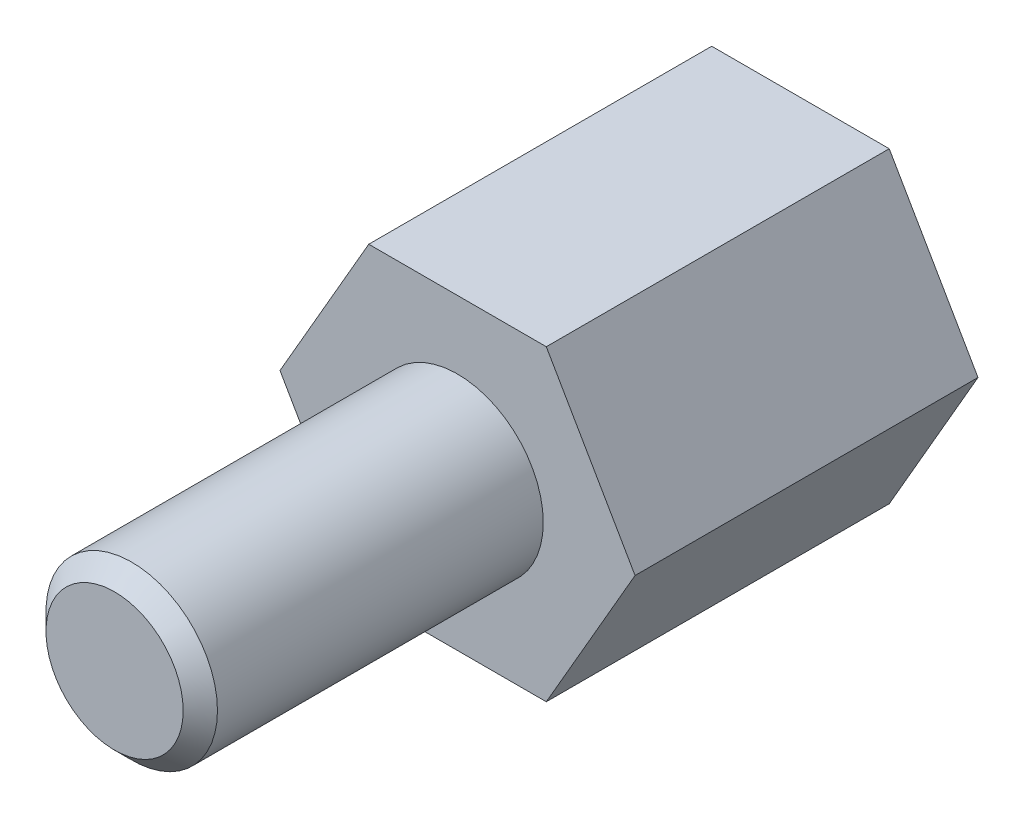
ISO-10303-21;
HEADER;
FILE_DESCRIPTION(('STEP AP214'),'2;1');
FILE_NAME('part.step','',(''),(''),'','','');
FILE_SCHEMA(('AUTOMOTIVE_DESIGN { 1 0 10303 214 1 1 1 1 }'));
ENDSEC;
DATA;
#1=APPLICATION_CONTEXT('core data for automotive mechanical design processes');
#2=APPLICATION_PROTOCOL_DEFINITION('international standard','automotive_design',2000,#1);
#3=PRODUCT_CONTEXT('',#1,'mechanical');
#4=PRODUCT('Part','Part','',(#3));
#5=PRODUCT_RELATED_PRODUCT_CATEGORY('part','',(#4));
#6=PRODUCT_DEFINITION_FORMATION('','',#4);
#7=PRODUCT_DEFINITION_CONTEXT('part definition',#1,'design');
#8=PRODUCT_DEFINITION('design','',#6,#7);
#9=PRODUCT_DEFINITION_SHAPE('','',#8);
#10=(LENGTH_UNIT() NAMED_UNIT(*) SI_UNIT(.MILLI.,.METRE.));
#11=(NAMED_UNIT(*) PLANE_ANGLE_UNIT() SI_UNIT($,.RADIAN.));
#12=(NAMED_UNIT(*) SI_UNIT($,.STERADIAN.) SOLID_ANGLE_UNIT());
#13=UNCERTAINTY_MEASURE_WITH_UNIT(LENGTH_MEASURE(1.E-05),#10,'distance_accuracy_value','');
#14=(GEOMETRIC_REPRESENTATION_CONTEXT(3) GLOBAL_UNCERTAINTY_ASSIGNED_CONTEXT((#13)) GLOBAL_UNIT_ASSIGNED_CONTEXT((#10,
#11,#12)) REPRESENTATION_CONTEXT('',''));
#15=CARTESIAN_POINT('',(0.,0.,0.));
#16=DIRECTION('',(0.,0.,1.));
#17=DIRECTION('',(1.,0.,0.));
#18=AXIS2_PLACEMENT_3D('',#15,#16,#17);
#19=CARTESIAN_POINT('',(0.,0.,6.));
#20=DIRECTION('',(0.,0.,1.));
#21=DIRECTION('',(1.,0.,0.));
#22=AXIS2_PLACEMENT_3D('',#19,#20,#21);
#23=PLANE('',#22);
#24=DIRECTION('',(-1.,0.,0.));
#25=VECTOR('',#24,1.);
#26=CARTESIAN_POINT('',(1.55307222412009,2.69,6.));
#27=LINE('',#26,#25);
#28=CARTESIAN_POINT('',(1.55307222412009,2.69,6.));
#29=VERTEX_POINT('',#28);
#30=CARTESIAN_POINT('',(-1.55307222412009,2.69,6.));
#31=VERTEX_POINT('',#30);
#32=EDGE_CURVE('E137',#29,#31,#27,.T.);
#33=ORIENTED_EDGE('',*,*,#32,.T.);
#34=DIRECTION('',(-0.5,-0.866025403784438,0.));
#35=VECTOR('',#34,1.);
#36=CARTESIAN_POINT('',(-1.55307222412009,2.69,6.));
#37=LINE('',#36,#35);
#38=CARTESIAN_POINT('',(-3.10614444824019,0.,6.));
#39=VERTEX_POINT('',#38);
#40=EDGE_CURVE('E94',#31,#39,#37,.T.);
#41=ORIENTED_EDGE('',*,*,#40,.T.);
#42=DIRECTION('',(0.5,-0.866025403784439,0.));
#43=VECTOR('',#42,1.);
#44=CARTESIAN_POINT('',(-3.10614444824019,0.,6.));
#45=LINE('',#44,#43);
#46=CARTESIAN_POINT('',(-1.5530722241201,-2.69,6.));
#47=VERTEX_POINT('',#46);
#48=EDGE_CURVE('E108',#39,#47,#45,.T.);
#49=ORIENTED_EDGE('',*,*,#48,.T.);
#50=DIRECTION('',(1.,0.,0.));
#51=VECTOR('',#50,1.);
#52=CARTESIAN_POINT('',(-1.5530722241201,-2.69,6.));
#53=LINE('',#52,#51);
#54=CARTESIAN_POINT('',(1.55307222412009,-2.69,6.));
#55=VERTEX_POINT('',#54);
#56=EDGE_CURVE('E102',#47,#55,#53,.T.);
#57=ORIENTED_EDGE('',*,*,#56,.T.);
#58=DIRECTION('',(0.5,0.866025403784438,0.));
#59=VECTOR('',#58,1.);
#60=CARTESIAN_POINT('',(1.55307222412009,-2.69,6.));
#61=LINE('',#60,#59);
#62=CARTESIAN_POINT('',(3.10614444824019,0.,6.));
#63=VERTEX_POINT('',#62);
#64=EDGE_CURVE('E106',#55,#63,#61,.T.);
#65=ORIENTED_EDGE('',*,*,#64,.T.);
#66=DIRECTION('',(-0.5,0.866025403784439,0.));
#67=VECTOR('',#66,1.);
#68=CARTESIAN_POINT('',(3.10614444824019,0.,6.));
#69=LINE('',#68,#67);
#70=EDGE_CURVE('E55',#63,#29,#69,.T.);
#71=ORIENTED_EDGE('',*,*,#70,.T.);
#72=EDGE_LOOP('',(#33,#41,#49,#57,#65,#71));
#73=FACE_BOUND('',#72,.T.);
#74=CARTESIAN_POINT('',(0.,0.,6.));
#75=DIRECTION('',(0.,0.,1.));
#76=DIRECTION('',(1.,0.,0.));
#77=AXIS2_PLACEMENT_3D('',#74,#75,#76);
#78=CIRCLE('',#77,1.5);
#79=CARTESIAN_POINT('',(1.5,0.,6.));
#80=VERTEX_POINT('',#79);
#81=EDGE_CURVE('E130',#80,#80,#78,.T.);
#82=ORIENTED_EDGE('',*,*,#81,.F.);
#83=EDGE_LOOP('',(#82));
#84=FACE_BOUND('',#83,.T.);
#85=ADVANCED_FACE('F38',(#73,#84),#23,.T.);
#86=CARTESIAN_POINT('',(1.55307222412009,2.69,6.));
#87=DIRECTION('',(0.,-1.,0.));
#88=DIRECTION('',(1.,0.,0.));
#89=AXIS2_PLACEMENT_3D('',#86,#87,#88);
#90=PLANE('',#89);
#91=DIRECTION('',(-1.,0.,0.));
#92=VECTOR('',#91,1.);
#93=CARTESIAN_POINT('',(1.55307222412009,2.69,0.));
#94=LINE('',#93,#92);
#95=CARTESIAN_POINT('',(1.55307222412009,2.69,0.));
#96=VERTEX_POINT('',#95);
#97=CARTESIAN_POINT('',(-1.55307222412009,2.69,0.));
#98=VERTEX_POINT('',#97);
#99=EDGE_CURVE('E126',#96,#98,#94,.T.);
#100=ORIENTED_EDGE('',*,*,#99,.T.);
#101=DIRECTION('',(0.,0.,-1.));
#102=VECTOR('',#101,1.);
#103=CARTESIAN_POINT('',(-1.55307222412009,2.69,6.));
#104=LINE('',#103,#102);
#105=EDGE_CURVE('E144',#31,#98,#104,.T.);
#106=ORIENTED_EDGE('',*,*,#105,.F.);
#107=ORIENTED_EDGE('',*,*,#32,.F.);
#108=DIRECTION('',(0.,0.,-1.));
#109=VECTOR('',#108,1.);
#110=CARTESIAN_POINT('',(1.55307222412009,2.69,6.));
#111=LINE('',#110,#109);
#112=EDGE_CURVE('E122',#29,#96,#111,.T.);
#113=ORIENTED_EDGE('',*,*,#112,.T.);
#114=EDGE_LOOP('',(#100,#106,#107,#113));
#115=FACE_BOUND('',#114,.T.);
#116=ADVANCED_FACE('F161',(#115),#90,.F.);
#117=CARTESIAN_POINT('',(-1.55307222412009,2.69,6.));
#118=DIRECTION('',(0.866025403784439,-0.5,0.));
#119=DIRECTION('',(0.5,0.866025403784439,0.));
#120=AXIS2_PLACEMENT_3D('',#117,#118,#119);
#121=PLANE('',#120);
#122=DIRECTION('',(-0.5,-0.866025403784438,0.));
#123=VECTOR('',#122,1.);
#124=CARTESIAN_POINT('',(-1.55307222412009,2.69,0.));
#125=LINE('',#124,#123);
#126=CARTESIAN_POINT('',(-3.10614444824019,0.,0.));
#127=VERTEX_POINT('',#126);
#128=EDGE_CURVE('E129',#98,#127,#125,.T.);
#129=ORIENTED_EDGE('',*,*,#128,.T.);
#130=DIRECTION('',(0.,0.,-1.));
#131=VECTOR('',#130,1.);
#132=CARTESIAN_POINT('',(-3.10614444824019,0.,6.));
#133=LINE('',#132,#131);
#134=EDGE_CURVE('E141',#39,#127,#133,.T.);
#135=ORIENTED_EDGE('',*,*,#134,.F.);
#136=ORIENTED_EDGE('',*,*,#40,.F.);
#137=ORIENTED_EDGE('',*,*,#105,.T.);
#138=EDGE_LOOP('',(#129,#135,#136,#137));
#139=FACE_BOUND('',#138,.T.);
#140=ADVANCED_FACE('F166',(#139),#121,.F.);
#141=CARTESIAN_POINT('',(-3.10614444824019,0.,6.));
#142=DIRECTION('',(0.866025403784439,0.5,0.));
#143=DIRECTION('',(-0.5,0.866025403784439,0.));
#144=AXIS2_PLACEMENT_3D('',#141,#142,#143);
#145=PLANE('',#144);
#146=DIRECTION('',(0.5,-0.866025403784439,0.));
#147=VECTOR('',#146,1.);
#148=CARTESIAN_POINT('',(-3.10614444824019,0.,0.));
#149=LINE('',#148,#147);
#150=CARTESIAN_POINT('',(-1.5530722241201,-2.69,0.));
#151=VERTEX_POINT('',#150);
#152=EDGE_CURVE('E132',#127,#151,#149,.T.);
#153=ORIENTED_EDGE('',*,*,#152,.T.);
#154=DIRECTION('',(0.,0.,-1.));
#155=VECTOR('',#154,1.);
#156=CARTESIAN_POINT('',(-1.5530722241201,-2.69,6.));
#157=LINE('',#156,#155);
#158=EDGE_CURVE('E117',#47,#151,#157,.T.);
#159=ORIENTED_EDGE('',*,*,#158,.F.);
#160=ORIENTED_EDGE('',*,*,#48,.F.);
#161=ORIENTED_EDGE('',*,*,#134,.T.);
#162=EDGE_LOOP('',(#153,#159,#160,#161));
#163=FACE_BOUND('',#162,.T.);
#164=ADVANCED_FACE('F183',(#163),#145,.F.);
#165=CARTESIAN_POINT('',(-1.5530722241201,-2.69,6.));
#166=DIRECTION('',(0.,1.,0.));
#167=DIRECTION('',(0.,0.,1.));
#168=AXIS2_PLACEMENT_3D('',#165,#166,#167);
#169=PLANE('',#168);
#170=DIRECTION('',(1.,0.,0.));
#171=VECTOR('',#170,1.);
#172=CARTESIAN_POINT('',(-1.5530722241201,-2.69,0.));
#173=LINE('',#172,#171);
#174=CARTESIAN_POINT('',(1.55307222412009,-2.69,0.));
#175=VERTEX_POINT('',#174);
#176=EDGE_CURVE('E116',#151,#175,#173,.T.);
#177=ORIENTED_EDGE('',*,*,#176,.T.);
#178=DIRECTION('',(0.,0.,-1.));
#179=VECTOR('',#178,1.);
#180=CARTESIAN_POINT('',(1.55307222412009,-2.69,6.));
#181=LINE('',#180,#179);
#182=EDGE_CURVE('E113',#55,#175,#181,.T.);
#183=ORIENTED_EDGE('',*,*,#182,.F.);
#184=ORIENTED_EDGE('',*,*,#56,.F.);
#185=ORIENTED_EDGE('',*,*,#158,.T.);
#186=EDGE_LOOP('',(#177,#183,#184,#185));
#187=FACE_BOUND('',#186,.T.);
#188=ADVANCED_FACE('F114',(#187),#169,.F.);
#189=CARTESIAN_POINT('',(1.55307222412009,-2.69,6.));
#190=DIRECTION('',(-0.866025403784438,0.5,0.));
#191=DIRECTION('',(-0.5,-0.866025403784439,0.));
#192=AXIS2_PLACEMENT_3D('',#189,#190,#191);
#193=PLANE('',#192);
#194=DIRECTION('',(0.5,0.866025403784438,0.));
#195=VECTOR('',#194,1.);
#196=CARTESIAN_POINT('',(1.55307222412009,-2.69,0.));
#197=LINE('',#196,#195);
#198=CARTESIAN_POINT('',(3.10614444824019,0.,0.));
#199=VERTEX_POINT('',#198);
#200=EDGE_CURVE('E79',#175,#199,#197,.T.);
#201=ORIENTED_EDGE('',*,*,#200,.T.);
#202=DIRECTION('',(0.,0.,-1.));
#203=VECTOR('',#202,1.);
#204=CARTESIAN_POINT('',(3.10614444824019,0.,6.));
#205=LINE('',#204,#203);
#206=EDGE_CURVE('E118',#63,#199,#205,.T.);
#207=ORIENTED_EDGE('',*,*,#206,.F.);
#208=ORIENTED_EDGE('',*,*,#64,.F.);
#209=ORIENTED_EDGE('',*,*,#182,.T.);
#210=EDGE_LOOP('',(#201,#207,#208,#209));
#211=FACE_BOUND('',#210,.T.);
#212=ADVANCED_FACE('F120',(#211),#193,.F.);
#213=CARTESIAN_POINT('',(3.10614444824019,0.,6.));
#214=DIRECTION('',(-0.866025403784439,-0.5,0.));
#215=DIRECTION('',(0.5,-0.866025403784439,0.));
#216=AXIS2_PLACEMENT_3D('',#213,#214,#215);
#217=PLANE('',#216);
#218=DIRECTION('',(-0.5,0.866025403784439,0.));
#219=VECTOR('',#218,1.);
#220=CARTESIAN_POINT('',(3.10614444824019,0.,0.));
#221=LINE('',#220,#219);
#222=EDGE_CURVE('E85',#199,#96,#221,.T.);
#223=ORIENTED_EDGE('',*,*,#222,.T.);
#224=ORIENTED_EDGE('',*,*,#112,.F.);
#225=ORIENTED_EDGE('',*,*,#70,.F.);
#226=ORIENTED_EDGE('',*,*,#206,.T.);
#227=EDGE_LOOP('',(#223,#224,#225,#226));
#228=FACE_BOUND('',#227,.T.);
#229=ADVANCED_FACE('F175',(#228),#217,.F.);
#230=CARTESIAN_POINT('',(0.,0.,0.));
#231=DIRECTION('',(0.,0.,1.));
#232=DIRECTION('',(1.,0.,0.));
#233=AXIS2_PLACEMENT_3D('',#230,#231,#232);
#234=PLANE('',#233);
#235=CARTESIAN_POINT('',(0.,0.,0.));
#236=DIRECTION('',(0.,0.,-1.));
#237=DIRECTION('',(-1.,0.,0.));
#238=AXIS2_PLACEMENT_3D('',#235,#236,#237);
#239=CIRCLE('',#238,1.24999999999999);
#240=CARTESIAN_POINT('',(-1.24999999999999,0.,0.));
#241=VERTEX_POINT('',#240);
#242=EDGE_CURVE('E203',#241,#241,#239,.T.);
#243=ORIENTED_EDGE('',*,*,#242,.F.);
#244=EDGE_LOOP('',(#243));
#245=FACE_BOUND('',#244,.T.);
#246=ORIENTED_EDGE('',*,*,#99,.F.);
#247=ORIENTED_EDGE('',*,*,#222,.F.);
#248=ORIENTED_EDGE('',*,*,#200,.F.);
#249=ORIENTED_EDGE('',*,*,#176,.F.);
#250=ORIENTED_EDGE('',*,*,#152,.F.);
#251=ORIENTED_EDGE('',*,*,#128,.F.);
#252=EDGE_LOOP('',(#246,#247,#248,#249,#250,#251));
#253=FACE_BOUND('',#252,.T.);
#254=ADVANCED_FACE('F172',(#245,#253),#234,.F.);
#255=CARTESIAN_POINT('',(0.,0.,12.));
#256=DIRECTION('',(0.,0.,-1.));
#257=DIRECTION('',(-1.,0.,0.));
#258=AXIS2_PLACEMENT_3D('',#255,#256,#257);
#259=CYLINDRICAL_SURFACE('',#258,1.5);
#260=CARTESIAN_POINT('',(0.,0.,11.7));
#261=DIRECTION('',(0.,0.,1.));
#262=DIRECTION('',(1.,0.,0.));
#263=AXIS2_PLACEMENT_3D('',#260,#261,#262);
#264=CIRCLE('',#263,1.5);
#265=CARTESIAN_POINT('',(1.5,0.,11.7));
#266=VERTEX_POINT('',#265);
#267=EDGE_CURVE('E11',#266,#266,#264,.F.);
#268=ORIENTED_EDGE('',*,*,#267,.T.);
#269=EDGE_LOOP('',(#268));
#270=FACE_BOUND('',#269,.T.);
#271=ORIENTED_EDGE('',*,*,#81,.T.);
#272=EDGE_LOOP('',(#271));
#273=FACE_BOUND('',#272,.T.);
#274=ADVANCED_FACE('F170',(#270,#273),#259,.T.);
#275=CARTESIAN_POINT('',(0.,0.,12.));
#276=DIRECTION('',(0.,0.,1.));
#277=DIRECTION('',(1.,0.,0.));
#278=AXIS2_PLACEMENT_3D('',#275,#276,#277);
#279=PLANE('',#278);
#280=CARTESIAN_POINT('',(0.,0.,12.));
#281=DIRECTION('',(0.,0.,1.));
#282=DIRECTION('',(1.,0.,0.));
#283=AXIS2_PLACEMENT_3D('',#280,#281,#282);
#284=CIRCLE('',#283,1.2);
#285=CARTESIAN_POINT('',(1.2,0.,12.));
#286=VERTEX_POINT('',#285);
#287=EDGE_CURVE('E47',#286,#286,#284,.T.);
#288=ORIENTED_EDGE('',*,*,#287,.T.);
#289=EDGE_LOOP('',(#288));
#290=FACE_BOUND('',#289,.T.);
#291=ADVANCED_FACE('F148',(#290),#279,.T.);
#292=CARTESIAN_POINT('',(0.,0.,5.));
#293=DIRECTION('',(0.,0.,-1.));
#294=DIRECTION('',(-1.,0.,0.));
#295=AXIS2_PLACEMENT_3D('',#292,#293,#294);
#296=CONICAL_SURFACE('',#295,1.25,1.02974425867665);
#297=CARTESIAN_POINT('',(0.,0.,5.75107577378445));
#298=VERTEX_POINT('',#297);
#299=VERTEX_LOOP('',#298);
#300=FACE_BOUND('',#299,.T.);
#301=CARTESIAN_POINT('',(0.,0.,5.));
#302=DIRECTION('',(0.,0.,-1.));
#303=DIRECTION('',(-1.,0.,0.));
#304=AXIS2_PLACEMENT_3D('',#301,#302,#303);
#305=CIRCLE('',#304,1.25);
#306=CARTESIAN_POINT('',(-1.25,0.,5.));
#307=VERTEX_POINT('',#306);
#308=EDGE_CURVE('E200',#307,#307,#305,.T.);
#309=ORIENTED_EDGE('',*,*,#308,.T.);
#310=EDGE_LOOP('',(#309));
#311=FACE_BOUND('',#310,.T.);
#312=ADVANCED_FACE('F156',(#300,#311),#296,.F.);
#313=CARTESIAN_POINT('',(0.,0.,0.));
#314=DIRECTION('',(0.,0.,-1.));
#315=DIRECTION('',(-1.,0.,0.));
#316=AXIS2_PLACEMENT_3D('',#313,#314,#315);
#317=CYLINDRICAL_SURFACE('',#316,1.24999999999999);
#318=ORIENTED_EDGE('',*,*,#308,.F.);
#319=EDGE_LOOP('',(#318));
#320=FACE_BOUND('',#319,.T.);
#321=ORIENTED_EDGE('',*,*,#242,.T.);
#322=EDGE_LOOP('',(#321));
#323=FACE_BOUND('',#322,.T.);
#324=ADVANCED_FACE('F151',(#320,#323),#317,.F.);
#325=CARTESIAN_POINT('',(0.,0.,12.));
#326=DIRECTION('',(0.,0.,-1.));
#327=DIRECTION('',(-1.,0.,0.));
#328=AXIS2_PLACEMENT_3D('',#325,#326,#327);
#329=CONICAL_SURFACE('',#328,1.2,0.785398163397444);
#330=ORIENTED_EDGE('',*,*,#267,.F.);
#331=EDGE_LOOP('',(#330));
#332=FACE_BOUND('',#331,.T.);
#333=ORIENTED_EDGE('',*,*,#287,.F.);
#334=EDGE_LOOP('',(#333));
#335=FACE_BOUND('',#334,.T.);
#336=ADVANCED_FACE('F40',(#332,#335),#329,.T.);
#337=CLOSED_SHELL('',(#85,#116,#140,#164,#188,#212,#229,#254,#274,#291,#312,#324,#336));
#338=MANIFOLD_SOLID_BREP('B2',#337);
#339=ADVANCED_BREP_SHAPE_REPRESENTATION('',(#18,#338),#14);
#340=SHAPE_DEFINITION_REPRESENTATION(#9,#339);
ENDSEC;
END-ISO-10303-21;
